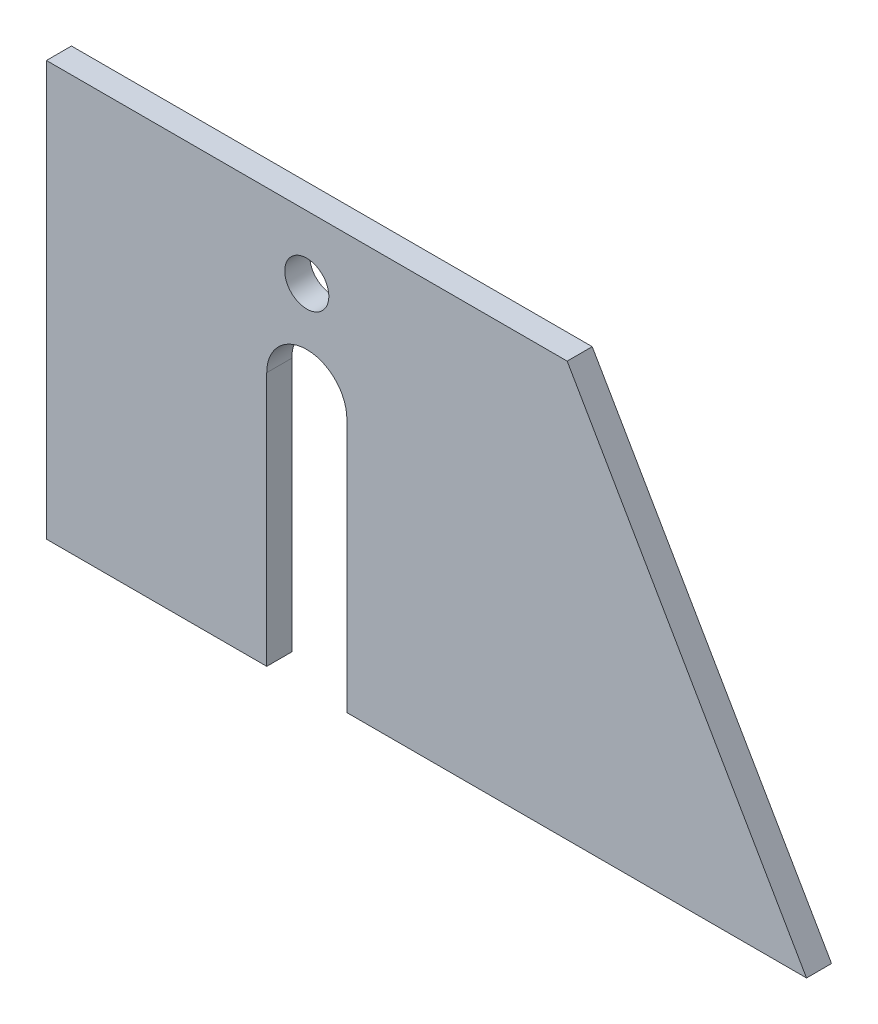
ISO-10303-21;
HEADER;
FILE_DESCRIPTION(('STEP AP214'),'2;1');
FILE_NAME('part.step','',(''),(''),'','','');
FILE_SCHEMA(('AUTOMOTIVE_DESIGN { 1 0 10303 214 1 1 1 1 }'));
ENDSEC;
DATA;
#1=APPLICATION_CONTEXT('core data for automotive mechanical design processes');
#2=APPLICATION_PROTOCOL_DEFINITION('international standard','automotive_design',2000,#1);
#3=PRODUCT_CONTEXT('',#1,'mechanical');
#4=PRODUCT('Part','Part','',(#3));
#5=PRODUCT_RELATED_PRODUCT_CATEGORY('part','',(#4));
#6=PRODUCT_DEFINITION_FORMATION('','',#4);
#7=PRODUCT_DEFINITION_CONTEXT('part definition',#1,'design');
#8=PRODUCT_DEFINITION('design','',#6,#7);
#9=PRODUCT_DEFINITION_SHAPE('','',#8);
#10=(LENGTH_UNIT() NAMED_UNIT(*) SI_UNIT(.MILLI.,.METRE.));
#11=(NAMED_UNIT(*) PLANE_ANGLE_UNIT() SI_UNIT($,.RADIAN.));
#12=(NAMED_UNIT(*) SI_UNIT($,.STERADIAN.) SOLID_ANGLE_UNIT());
#13=UNCERTAINTY_MEASURE_WITH_UNIT(LENGTH_MEASURE(1.E-05),#10,'distance_accuracy_value','');
#14=(GEOMETRIC_REPRESENTATION_CONTEXT(3) GLOBAL_UNCERTAINTY_ASSIGNED_CONTEXT((#13)) GLOBAL_UNIT_ASSIGNED_CONTEXT((#10,
#11,#12)) REPRESENTATION_CONTEXT('',''));
#15=CARTESIAN_POINT('',(0.,0.,0.));
#16=DIRECTION('',(0.,0.,1.));
#17=DIRECTION('',(1.,0.,0.));
#18=AXIS2_PLACEMENT_3D('',#15,#16,#17);
#19=CARTESIAN_POINT('',(0.,0.,3.125));
#20=DIRECTION('',(0.,0.,1.));
#21=DIRECTION('',(1.,0.,0.));
#22=AXIS2_PLACEMENT_3D('',#19,#20,#21);
#23=PLANE('',#22);
#24=DIRECTION('',(0.,-1.,0.));
#25=VECTOR('',#24,1.);
#26=CARTESIAN_POINT('',(-32.5,20.,3.125));
#27=LINE('',#26,#25);
#28=CARTESIAN_POINT('',(-32.5,20.,3.125));
#29=VERTEX_POINT('',#28);
#30=CARTESIAN_POINT('',(-32.5,-31.75,3.125));
#31=VERTEX_POINT('',#30);
#32=EDGE_CURVE('E155',#29,#31,#27,.T.);
#33=ORIENTED_EDGE('',*,*,#32,.T.);
#34=DIRECTION('',(1.,0.,0.));
#35=VECTOR('',#34,1.);
#36=CARTESIAN_POINT('',(-32.5,-31.75,3.125));
#37=LINE('',#36,#35);
#38=CARTESIAN_POINT('',(-5.,-31.75,3.125));
#39=VERTEX_POINT('',#38);
#40=EDGE_CURVE('E103',#31,#39,#37,.T.);
#41=ORIENTED_EDGE('',*,*,#40,.T.);
#42=DIRECTION('',(0.,1.,0.));
#43=VECTOR('',#42,1.);
#44=CARTESIAN_POINT('',(-5.,0.,3.125));
#45=LINE('',#44,#43);
#46=CARTESIAN_POINT('',(-5.,0.,3.125));
#47=VERTEX_POINT('',#46);
#48=EDGE_CURVE('E170',#39,#47,#45,.T.);
#49=ORIENTED_EDGE('',*,*,#48,.T.);
#50=CARTESIAN_POINT('',(0.,0.,3.125));
#51=DIRECTION('',(0.,0.,-1.));
#52=DIRECTION('',(1.,0.,0.));
#53=AXIS2_PLACEMENT_3D('',#50,#51,#52);
#54=CIRCLE('',#53,5.);
#55=CARTESIAN_POINT('',(5.,0.,3.125));
#56=VERTEX_POINT('',#55);
#57=EDGE_CURVE('E183',#47,#56,#54,.T.);
#58=ORIENTED_EDGE('',*,*,#57,.T.);
#59=DIRECTION('',(0.,-1.,0.));
#60=VECTOR('',#59,1.);
#61=CARTESIAN_POINT('',(5.,0.,3.125));
#62=LINE('',#61,#60);
#63=CARTESIAN_POINT('',(5.,-31.75,3.125));
#64=VERTEX_POINT('',#63);
#65=EDGE_CURVE('E122',#56,#64,#62,.T.);
#66=ORIENTED_EDGE('',*,*,#65,.T.);
#67=DIRECTION('',(1.,0.,0.));
#68=VECTOR('',#67,1.);
#69=CARTESIAN_POINT('',(5.,-31.75,3.125));
#70=LINE('',#69,#68);
#71=CARTESIAN_POINT('',(62.377876430563,-31.75,3.125));
#72=VERTEX_POINT('',#71);
#73=EDGE_CURVE('E116',#64,#72,#70,.T.);
#74=ORIENTED_EDGE('',*,*,#73,.T.);
#75=DIRECTION('',(-0.499999999999998,0.86602540378444,0.));
#76=VECTOR('',#75,1.);
#77=CARTESIAN_POINT('',(32.5,20.,3.125));
#78=LINE('',#77,#76);
#79=CARTESIAN_POINT('',(32.5,20.,3.125));
#80=VERTEX_POINT('',#79);
#81=EDGE_CURVE('E120',#72,#80,#78,.T.);
#82=ORIENTED_EDGE('',*,*,#81,.T.);
#83=DIRECTION('',(-1.,0.,0.));
#84=VECTOR('',#83,1.);
#85=CARTESIAN_POINT('',(-32.5,20.,3.125));
#86=LINE('',#85,#84);
#87=EDGE_CURVE('E60',#80,#29,#86,.T.);
#88=ORIENTED_EDGE('',*,*,#87,.T.);
#89=EDGE_LOOP('',(#33,#41,#49,#58,#66,#74,#82,#88));
#90=FACE_BOUND('',#89,.T.);
#91=CARTESIAN_POINT('',(0.,12.125,3.125));
#92=DIRECTION('',(0.,0.,1.));
#93=DIRECTION('',(1.,0.,0.));
#94=AXIS2_PLACEMENT_3D('',#91,#92,#93);
#95=CIRCLE('',#94,2.75);
#96=CARTESIAN_POINT('',(2.75,12.125,3.125));
#97=VERTEX_POINT('',#96);
#98=EDGE_CURVE('E143',#97,#97,#95,.T.);
#99=ORIENTED_EDGE('',*,*,#98,.F.);
#100=EDGE_LOOP('',(#99));
#101=FACE_BOUND('',#100,.T.);
#102=ADVANCED_FACE('F43',(#90,#101),#23,.T.);
#103=CARTESIAN_POINT('',(0.,0.,0.));
#104=DIRECTION('',(0.,0.,1.));
#105=DIRECTION('',(1.,0.,0.));
#106=AXIS2_PLACEMENT_3D('',#103,#104,#105);
#107=PLANE('',#106);
#108=DIRECTION('',(0.,-1.,0.));
#109=VECTOR('',#108,1.);
#110=CARTESIAN_POINT('',(-32.5,20.,0.));
#111=LINE('',#110,#109);
#112=CARTESIAN_POINT('',(-32.5,20.,0.));
#113=VERTEX_POINT('',#112);
#114=CARTESIAN_POINT('',(-32.5,-31.75,0.));
#115=VERTEX_POINT('',#114);
#116=EDGE_CURVE('E139',#113,#115,#111,.T.);
#117=ORIENTED_EDGE('',*,*,#116,.F.);
#118=DIRECTION('',(-1.,0.,0.));
#119=VECTOR('',#118,1.);
#120=CARTESIAN_POINT('',(-32.5,20.,0.));
#121=LINE('',#120,#119);
#122=CARTESIAN_POINT('',(32.5,20.,0.));
#123=VERTEX_POINT('',#122);
#124=EDGE_CURVE('E95',#123,#113,#121,.T.);
#125=ORIENTED_EDGE('',*,*,#124,.F.);
#126=DIRECTION('',(-0.499999999999998,0.86602540378444,0.));
#127=VECTOR('',#126,1.);
#128=CARTESIAN_POINT('',(32.5,20.,0.));
#129=LINE('',#128,#127);
#130=CARTESIAN_POINT('',(62.377876430563,-31.75,0.));
#131=VERTEX_POINT('',#130);
#132=EDGE_CURVE('E89',#131,#123,#129,.T.);
#133=ORIENTED_EDGE('',*,*,#132,.F.);
#134=DIRECTION('',(1.,0.,0.));
#135=VECTOR('',#134,1.);
#136=CARTESIAN_POINT('',(62.377876430563,-31.75,0.));
#137=LINE('',#136,#135);
#138=CARTESIAN_POINT('',(5.,-31.75,0.));
#139=VERTEX_POINT('',#138);
#140=EDGE_CURVE('E129',#139,#131,#137,.T.);
#141=ORIENTED_EDGE('',*,*,#140,.F.);
#142=DIRECTION('',(0.,-1.,0.));
#143=VECTOR('',#142,1.);
#144=CARTESIAN_POINT('',(5.,0.,0.));
#145=LINE('',#144,#143);
#146=CARTESIAN_POINT('',(5.,0.,0.));
#147=VERTEX_POINT('',#146);
#148=EDGE_CURVE('E149',#147,#139,#145,.T.);
#149=ORIENTED_EDGE('',*,*,#148,.F.);
#150=CARTESIAN_POINT('',(0.,0.,0.));
#151=DIRECTION('',(0.,0.,-1.));
#152=DIRECTION('',(1.,0.,0.));
#153=AXIS2_PLACEMENT_3D('',#150,#151,#152);
#154=CIRCLE('',#153,5.);
#155=CARTESIAN_POINT('',(-5.,0.,0.));
#156=VERTEX_POINT('',#155);
#157=EDGE_CURVE('E147',#156,#147,#154,.T.);
#158=ORIENTED_EDGE('',*,*,#157,.F.);
#159=DIRECTION('',(0.,1.,0.));
#160=VECTOR('',#159,1.);
#161=CARTESIAN_POINT('',(-5.,0.,0.));
#162=LINE('',#161,#160);
#163=CARTESIAN_POINT('',(-5.,-31.75,0.));
#164=VERTEX_POINT('',#163);
#165=EDGE_CURVE('E145',#164,#156,#162,.T.);
#166=ORIENTED_EDGE('',*,*,#165,.F.);
#167=DIRECTION('',(1.,0.,0.));
#168=VECTOR('',#167,1.);
#169=CARTESIAN_POINT('',(-32.5,-31.75,0.));
#170=LINE('',#169,#168);
#171=EDGE_CURVE('E142',#115,#164,#170,.T.);
#172=ORIENTED_EDGE('',*,*,#171,.F.);
#173=EDGE_LOOP('',(#117,#125,#133,#141,#149,#158,#166,#172));
#174=FACE_BOUND('',#173,.T.);
#175=CARTESIAN_POINT('',(0.,12.125,0.));
#176=DIRECTION('',(0.,0.,1.));
#177=DIRECTION('',(1.,0.,0.));
#178=AXIS2_PLACEMENT_3D('',#175,#176,#177);
#179=CIRCLE('',#178,2.75);
#180=CARTESIAN_POINT('',(2.75,12.125,0.));
#181=VERTEX_POINT('',#180);
#182=EDGE_CURVE('E189',#181,#181,#179,.T.);
#183=ORIENTED_EDGE('',*,*,#182,.T.);
#184=EDGE_LOOP('',(#183));
#185=FACE_BOUND('',#184,.T.);
#186=ADVANCED_FACE('F174',(#174,#185),#107,.F.);
#187=CARTESIAN_POINT('',(-32.5,20.,3.125));
#188=DIRECTION('',(1.,0.,0.));
#189=DIRECTION('',(0.,1.,0.));
#190=AXIS2_PLACEMENT_3D('',#187,#188,#189);
#191=PLANE('',#190);
#192=ORIENTED_EDGE('',*,*,#116,.T.);
#193=DIRECTION('',(0.,0.,-1.));
#194=VECTOR('',#193,1.);
#195=CARTESIAN_POINT('',(-32.5,-31.75,3.125));
#196=LINE('',#195,#194);
#197=EDGE_CURVE('E11',#31,#115,#196,.T.);
#198=ORIENTED_EDGE('',*,*,#197,.F.);
#199=ORIENTED_EDGE('',*,*,#32,.F.);
#200=DIRECTION('',(0.,0.,-1.));
#201=VECTOR('',#200,1.);
#202=CARTESIAN_POINT('',(-32.5,20.,3.125));
#203=LINE('',#202,#201);
#204=EDGE_CURVE('E135',#29,#113,#203,.T.);
#205=ORIENTED_EDGE('',*,*,#204,.T.);
#206=EDGE_LOOP('',(#192,#198,#199,#205));
#207=FACE_BOUND('',#206,.T.);
#208=ADVANCED_FACE('F45',(#207),#191,.F.);
#209=CARTESIAN_POINT('',(-32.5,-31.75,3.125));
#210=DIRECTION('',(0.,1.,0.));
#211=DIRECTION('',(-1.,0.,0.));
#212=AXIS2_PLACEMENT_3D('',#209,#210,#211);
#213=PLANE('',#212);
#214=ORIENTED_EDGE('',*,*,#171,.T.);
#215=DIRECTION('',(0.,0.,-1.));
#216=VECTOR('',#215,1.);
#217=CARTESIAN_POINT('',(-5.,-31.75,3.125));
#218=LINE('',#217,#216);
#219=EDGE_CURVE('E52',#39,#164,#218,.T.);
#220=ORIENTED_EDGE('',*,*,#219,.F.);
#221=ORIENTED_EDGE('',*,*,#40,.F.);
#222=ORIENTED_EDGE('',*,*,#197,.T.);
#223=EDGE_LOOP('',(#214,#220,#221,#222));
#224=FACE_BOUND('',#223,.T.);
#225=ADVANCED_FACE('F217',(#224),#213,.F.);
#226=CARTESIAN_POINT('',(-5.,0.,3.125));
#227=DIRECTION('',(-1.,0.,0.));
#228=DIRECTION('',(0.,-1.,0.));
#229=AXIS2_PLACEMENT_3D('',#226,#227,#228);
#230=PLANE('',#229);
#231=ORIENTED_EDGE('',*,*,#165,.T.);
#232=DIRECTION('',(0.,0.,-1.));
#233=VECTOR('',#232,1.);
#234=CARTESIAN_POINT('',(-5.,0.,3.125));
#235=LINE('',#234,#233);
#236=EDGE_CURVE('E162',#47,#156,#235,.T.);
#237=ORIENTED_EDGE('',*,*,#236,.F.);
#238=ORIENTED_EDGE('',*,*,#48,.F.);
#239=ORIENTED_EDGE('',*,*,#219,.T.);
#240=EDGE_LOOP('',(#231,#237,#238,#239));
#241=FACE_BOUND('',#240,.T.);
#242=ADVANCED_FACE('F168',(#241),#230,.F.);
#243=CARTESIAN_POINT('',(0.,0.,3.125));
#244=DIRECTION('',(0.,0.,-1.));
#245=DIRECTION('',(-1.,0.,0.));
#246=AXIS2_PLACEMENT_3D('',#243,#244,#245);
#247=CYLINDRICAL_SURFACE('',#246,5.);
#248=ORIENTED_EDGE('',*,*,#157,.T.);
#249=DIRECTION('',(0.,0.,-1.));
#250=VECTOR('',#249,1.);
#251=CARTESIAN_POINT('',(5.,0.,3.125));
#252=LINE('',#251,#250);
#253=EDGE_CURVE('E159',#56,#147,#252,.T.);
#254=ORIENTED_EDGE('',*,*,#253,.F.);
#255=ORIENTED_EDGE('',*,*,#57,.F.);
#256=ORIENTED_EDGE('',*,*,#236,.T.);
#257=EDGE_LOOP('',(#248,#254,#255,#256));
#258=FACE_BOUND('',#257,.T.);
#259=ADVANCED_FACE('F179',(#258),#247,.F.);
#260=CARTESIAN_POINT('',(5.,0.,3.125));
#261=DIRECTION('',(1.,0.,0.));
#262=DIRECTION('',(0.,1.,0.));
#263=AXIS2_PLACEMENT_3D('',#260,#261,#262);
#264=PLANE('',#263);
#265=ORIENTED_EDGE('',*,*,#148,.T.);
#266=DIRECTION('',(0.,0.,-1.));
#267=VECTOR('',#266,1.);
#268=CARTESIAN_POINT('',(5.,-31.75,3.125));
#269=LINE('',#268,#267);
#270=EDGE_CURVE('E130',#64,#139,#269,.T.);
#271=ORIENTED_EDGE('',*,*,#270,.F.);
#272=ORIENTED_EDGE('',*,*,#65,.F.);
#273=ORIENTED_EDGE('',*,*,#253,.T.);
#274=EDGE_LOOP('',(#265,#271,#272,#273));
#275=FACE_BOUND('',#274,.T.);
#276=ADVANCED_FACE('F182',(#275),#264,.F.);
#277=CARTESIAN_POINT('',(62.377876430563,-31.75,3.125));
#278=DIRECTION('',(0.,1.,0.));
#279=DIRECTION('',(0.,0.,1.));
#280=AXIS2_PLACEMENT_3D('',#277,#278,#279);
#281=PLANE('',#280);
#282=ORIENTED_EDGE('',*,*,#140,.T.);
#283=DIRECTION('',(0.,0.,-1.));
#284=VECTOR('',#283,1.);
#285=CARTESIAN_POINT('',(62.377876430563,-31.75,3.125));
#286=LINE('',#285,#284);
#287=EDGE_CURVE('E127',#72,#131,#286,.T.);
#288=ORIENTED_EDGE('',*,*,#287,.F.);
#289=ORIENTED_EDGE('',*,*,#73,.F.);
#290=ORIENTED_EDGE('',*,*,#270,.T.);
#291=EDGE_LOOP('',(#282,#288,#289,#290));
#292=FACE_BOUND('',#291,.T.);
#293=ADVANCED_FACE('F128',(#292),#281,.F.);
#294=CARTESIAN_POINT('',(32.5,20.,3.125));
#295=DIRECTION('',(-0.86602540378444,-0.499999999999998,0.));
#296=DIRECTION('',(0.499999999999998,-0.86602540378444,0.));
#297=AXIS2_PLACEMENT_3D('',#294,#295,#296);
#298=PLANE('',#297);
#299=ORIENTED_EDGE('',*,*,#132,.T.);
#300=DIRECTION('',(0.,0.,-1.));
#301=VECTOR('',#300,1.);
#302=CARTESIAN_POINT('',(32.5,20.,3.125));
#303=LINE('',#302,#301);
#304=EDGE_CURVE('E131',#80,#123,#303,.T.);
#305=ORIENTED_EDGE('',*,*,#304,.F.);
#306=ORIENTED_EDGE('',*,*,#81,.F.);
#307=ORIENTED_EDGE('',*,*,#287,.T.);
#308=EDGE_LOOP('',(#299,#305,#306,#307));
#309=FACE_BOUND('',#308,.T.);
#310=ADVANCED_FACE('F133',(#309),#298,.F.);
#311=CARTESIAN_POINT('',(-32.5,20.,3.125));
#312=DIRECTION('',(0.,-1.,0.));
#313=DIRECTION('',(0.,0.,-1.));
#314=AXIS2_PLACEMENT_3D('',#311,#312,#313);
#315=PLANE('',#314);
#316=ORIENTED_EDGE('',*,*,#124,.T.);
#317=ORIENTED_EDGE('',*,*,#204,.F.);
#318=ORIENTED_EDGE('',*,*,#87,.F.);
#319=ORIENTED_EDGE('',*,*,#304,.T.);
#320=EDGE_LOOP('',(#316,#317,#318,#319));
#321=FACE_BOUND('',#320,.T.);
#322=ADVANCED_FACE('F205',(#321),#315,.F.);
#323=CARTESIAN_POINT('',(0.,12.125,3.125));
#324=DIRECTION('',(0.,0.,-1.));
#325=DIRECTION('',(-1.,0.,0.));
#326=AXIS2_PLACEMENT_3D('',#323,#324,#325);
#327=CYLINDRICAL_SURFACE('',#326,2.75);
#328=ORIENTED_EDGE('',*,*,#98,.T.);
#329=EDGE_LOOP('',(#328));
#330=FACE_BOUND('',#329,.T.);
#331=ORIENTED_EDGE('',*,*,#182,.F.);
#332=EDGE_LOOP('',(#331));
#333=FACE_BOUND('',#332,.T.);
#334=ADVANCED_FACE('F195',(#330,#333),#327,.F.);
#335=CLOSED_SHELL('',(#102,#186,#208,#225,#242,#259,#276,#293,#310,#322,#334));
#336=MANIFOLD_SOLID_BREP('B2',#335);
#337=ADVANCED_BREP_SHAPE_REPRESENTATION('',(#18,#336),#14);
#338=SHAPE_DEFINITION_REPRESENTATION(#9,#337);
ENDSEC;
END-ISO-10303-21;
